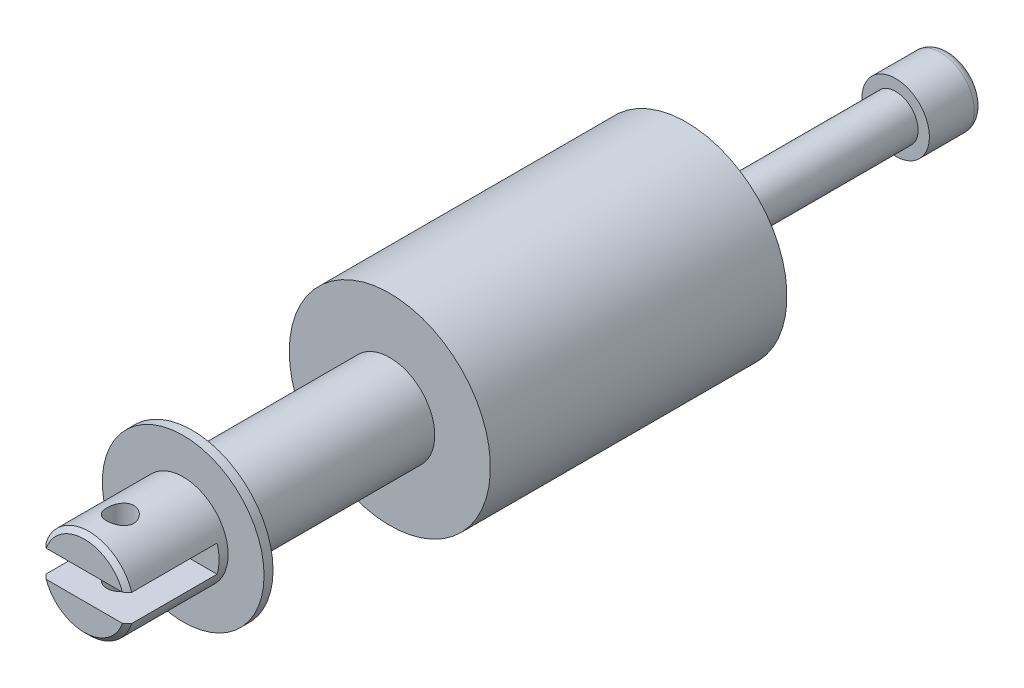
ISO-10303-21;
HEADER;
FILE_DESCRIPTION(('STEP AP214'),'2;1');
FILE_NAME('part.step','',(''),(''),'','','');
FILE_SCHEMA(('AUTOMOTIVE_DESIGN { 1 0 10303 214 1 1 1 1 }'));
ENDSEC;
DATA;
#1=APPLICATION_CONTEXT('core data for automotive mechanical design processes');
#2=APPLICATION_PROTOCOL_DEFINITION('international standard','automotive_design',2000,#1);
#3=PRODUCT_CONTEXT('',#1,'mechanical');
#4=PRODUCT('Part','Part','',(#3));
#5=PRODUCT_RELATED_PRODUCT_CATEGORY('part','',(#4));
#6=PRODUCT_DEFINITION_FORMATION('','',#4);
#7=PRODUCT_DEFINITION_CONTEXT('part definition',#1,'design');
#8=PRODUCT_DEFINITION('design','',#6,#7);
#9=PRODUCT_DEFINITION_SHAPE('','',#8);
#10=(LENGTH_UNIT() NAMED_UNIT(*) SI_UNIT(.MILLI.,.METRE.));
#11=(NAMED_UNIT(*) PLANE_ANGLE_UNIT() SI_UNIT($,.RADIAN.));
#12=(NAMED_UNIT(*) SI_UNIT($,.STERADIAN.) SOLID_ANGLE_UNIT());
#13=UNCERTAINTY_MEASURE_WITH_UNIT(LENGTH_MEASURE(1.E-05),#10,'distance_accuracy_value','');
#14=(GEOMETRIC_REPRESENTATION_CONTEXT(3) GLOBAL_UNCERTAINTY_ASSIGNED_CONTEXT((#13)) GLOBAL_UNIT_ASSIGNED_CONTEXT((#10,
#11,#12)) REPRESENTATION_CONTEXT('',''));
#15=CARTESIAN_POINT('',(0.,0.,0.));
#16=DIRECTION('',(0.,0.,1.));
#17=DIRECTION('',(1.,0.,0.));
#18=AXIS2_PLACEMENT_3D('',#15,#16,#17);
#19=CARTESIAN_POINT('',(0.,0.,-46.1131813977626));
#20=DIRECTION('',(0.,0.,-1.));
#21=DIRECTION('',(-1.,0.,0.));
#22=AXIS2_PLACEMENT_3D('',#19,#20,#21);
#23=CYLINDRICAL_SURFACE('',#22,5.00000000000001);
#24=CARTESIAN_POINT('',(0.,0.,41.3710992223477));
#25=DIRECTION('',(0.,0.,-1.));
#26=DIRECTION('',(-1.,0.,0.));
#27=AXIS2_PLACEMENT_3D('',#24,#25,#26);
#28=CIRCLE('',#27,5.00000000000001);
#29=CARTESIAN_POINT('',(-5.00000000000001,0.,41.3710992223477));
#30=VERTEX_POINT('',#29);
#31=EDGE_CURVE('E209',#30,#30,#28,.T.);
#32=ORIENTED_EDGE('',*,*,#31,.F.);
#33=EDGE_LOOP('',(#32));
#34=FACE_BOUND('',#33,.T.);
#35=CARTESIAN_POINT('',(0.,0.,63.3710992223477));
#36=DIRECTION('',(0.,0.,1.));
#37=DIRECTION('',(1.,0.,0.));
#38=AXIS2_PLACEMENT_3D('',#35,#36,#37);
#39=CIRCLE('',#38,5.00000000000001);
#40=CARTESIAN_POINT('',(5.00000000000001,0.,63.3710992223477));
#41=VERTEX_POINT('',#40);
#42=EDGE_CURVE('E11',#41,#41,#39,.T.);
#43=ORIENTED_EDGE('',*,*,#42,.F.);
#44=EDGE_LOOP('',(#43));
#45=FACE_BOUND('',#44,.T.);
#46=ADVANCED_FACE('F36',(#34,#45),#23,.T.);
#47=CARTESIAN_POINT('',(11.1954432282886,0.,41.3710992223477));
#48=DIRECTION('',(0.,0.,-1.));
#49=DIRECTION('',(-1.,0.,0.));
#50=AXIS2_PLACEMENT_3D('',#47,#48,#49);
#51=PLANE('',#50);
#52=CARTESIAN_POINT('',(0.,0.,41.3710992223477));
#53=DIRECTION('',(0.,0.,-1.));
#54=DIRECTION('',(-1.,0.,0.));
#55=AXIS2_PLACEMENT_3D('',#52,#53,#54);
#56=CIRCLE('',#55,11.1954432282886);
#57=CARTESIAN_POINT('',(-11.1954432282886,0.,41.3710992223477));
#58=VERTEX_POINT('',#57);
#59=EDGE_CURVE('E308',#58,#58,#56,.T.);
#60=ORIENTED_EDGE('',*,*,#59,.F.);
#61=EDGE_LOOP('',(#60));
#62=FACE_BOUND('',#61,.T.);
#63=ORIENTED_EDGE('',*,*,#31,.T.);
#64=EDGE_LOOP('',(#63));
#65=FACE_BOUND('',#64,.T.);
#66=ADVANCED_FACE('F160',(#62,#65),#51,.F.);
#67=CARTESIAN_POINT('',(0.,0.,-46.1131813977626));
#68=DIRECTION('',(0.,0.,-1.));
#69=DIRECTION('',(-1.,0.,0.));
#70=AXIS2_PLACEMENT_3D('',#67,#68,#69);
#71=CYLINDRICAL_SURFACE('',#70,11.1954432282886);
#72=CARTESIAN_POINT('',(0.,0.,8.37109922234772));
#73=DIRECTION('',(0.,0.,-1.));
#74=DIRECTION('',(-1.,0.,0.));
#75=AXIS2_PLACEMENT_3D('',#72,#73,#74);
#76=CIRCLE('',#75,11.1954432282886);
#77=CARTESIAN_POINT('',(-11.1954432282886,0.,8.37109922234772));
#78=VERTEX_POINT('',#77);
#79=EDGE_CURVE('E305',#78,#78,#76,.T.);
#80=ORIENTED_EDGE('',*,*,#79,.F.);
#81=EDGE_LOOP('',(#80));
#82=FACE_BOUND('',#81,.T.);
#83=ORIENTED_EDGE('',*,*,#59,.T.);
#84=EDGE_LOOP('',(#83));
#85=FACE_BOUND('',#84,.T.);
#86=ADVANCED_FACE('F156',(#82,#85),#71,.T.);
#87=CARTESIAN_POINT('',(2.49999999999999,0.,8.37109922234772));
#88=DIRECTION('',(0.,0.,1.));
#89=DIRECTION('',(1.,0.,0.));
#90=AXIS2_PLACEMENT_3D('',#87,#88,#89);
#91=PLANE('',#90);
#92=CARTESIAN_POINT('',(0.,0.,8.37109922234772));
#93=DIRECTION('',(0.,0.,-1.));
#94=DIRECTION('',(-1.,0.,0.));
#95=AXIS2_PLACEMENT_3D('',#92,#93,#94);
#96=CIRCLE('',#95,2.49999999999999);
#97=CARTESIAN_POINT('',(-2.49999999999999,0.,8.37109922234772));
#98=VERTEX_POINT('',#97);
#99=EDGE_CURVE('E302',#98,#98,#96,.T.);
#100=ORIENTED_EDGE('',*,*,#99,.F.);
#101=EDGE_LOOP('',(#100));
#102=FACE_BOUND('',#101,.T.);
#103=ORIENTED_EDGE('',*,*,#79,.T.);
#104=EDGE_LOOP('',(#103));
#105=FACE_BOUND('',#104,.T.);
#106=ADVANCED_FACE('F152',(#102,#105),#91,.F.);
#107=CARTESIAN_POINT('',(0.,0.,-46.1131813977626));
#108=DIRECTION('',(0.,0.,-1.));
#109=DIRECTION('',(-1.,0.,0.));
#110=AXIS2_PLACEMENT_3D('',#107,#108,#109);
#111=CYLINDRICAL_SURFACE('',#110,2.49999999999999);
#112=CARTESIAN_POINT('',(0.,0.,-14.9289007776523));
#113=DIRECTION('',(0.,0.,-1.));
#114=DIRECTION('',(-1.,0.,0.));
#115=AXIS2_PLACEMENT_3D('',#112,#113,#114);
#116=CIRCLE('',#115,2.49999999999999);
#117=CARTESIAN_POINT('',(-2.49999999999999,0.,-14.9289007776523));
#118=VERTEX_POINT('',#117);
#119=EDGE_CURVE('E299',#118,#118,#116,.T.);
#120=ORIENTED_EDGE('',*,*,#119,.F.);
#121=EDGE_LOOP('',(#120));
#122=FACE_BOUND('',#121,.T.);
#123=ORIENTED_EDGE('',*,*,#99,.T.);
#124=EDGE_LOOP('',(#123));
#125=FACE_BOUND('',#124,.T.);
#126=ADVANCED_FACE('F148',(#122,#125),#111,.T.);
#127=CARTESIAN_POINT('',(2.49999999999999,0.,-14.9289007776523));
#128=DIRECTION('',(0.,0.,-1.));
#129=DIRECTION('',(-1.,0.,0.));
#130=AXIS2_PLACEMENT_3D('',#127,#128,#129);
#131=PLANE('',#130);
#132=CARTESIAN_POINT('',(0.,0.,-14.9289007776523));
#133=DIRECTION('',(0.,0.,-1.));
#134=DIRECTION('',(-1.,0.,0.));
#135=AXIS2_PLACEMENT_3D('',#132,#133,#134);
#136=CIRCLE('',#135,3.75000000000001);
#137=CARTESIAN_POINT('',(-3.75000000000001,0.,-14.9289007776523));
#138=VERTEX_POINT('',#137);
#139=EDGE_CURVE('E291',#138,#138,#136,.T.);
#140=ORIENTED_EDGE('',*,*,#139,.F.);
#141=EDGE_LOOP('',(#140));
#142=FACE_BOUND('',#141,.T.);
#143=ORIENTED_EDGE('',*,*,#119,.T.);
#144=EDGE_LOOP('',(#143));
#145=FACE_BOUND('',#144,.T.);
#146=ADVANCED_FACE('F144',(#142,#145),#131,.F.);
#147=CARTESIAN_POINT('',(0.,0.,-46.1131813977626));
#148=DIRECTION('',(0.,0.,-1.));
#149=DIRECTION('',(-1.,0.,0.));
#150=AXIS2_PLACEMENT_3D('',#147,#148,#149);
#151=CYLINDRICAL_SURFACE('',#150,3.75000000000001);
#152=CARTESIAN_POINT('',(0.,0.,-19.9289007776523));
#153=DIRECTION('',(0.,0.,1.));
#154=DIRECTION('',(1.,0.,0.));
#155=AXIS2_PLACEMENT_3D('',#152,#153,#154);
#156=CIRCLE('',#155,3.75000000000001);
#157=CARTESIAN_POINT('',(3.75000000000001,0.,-19.9289007776523));
#158=VERTEX_POINT('',#157);
#159=EDGE_CURVE('E44',#158,#158,#156,.T.);
#160=ORIENTED_EDGE('',*,*,#159,.T.);
#161=EDGE_LOOP('',(#160));
#162=FACE_BOUND('',#161,.T.);
#163=ORIENTED_EDGE('',*,*,#139,.T.);
#164=EDGE_LOOP('',(#163));
#165=FACE_BOUND('',#164,.T.);
#166=ADVANCED_FACE('F140',(#162,#165),#151,.T.);
#167=CARTESIAN_POINT('',(2.49999999999999,0.,-20.9289007776523));
#168=DIRECTION('',(0.,0.,1.));
#169=DIRECTION('',(1.,0.,0.));
#170=AXIS2_PLACEMENT_3D('',#167,#168,#169);
#171=PLANE('',#170);
#172=CARTESIAN_POINT('',(0.,0.,-20.9289007776523));
#173=DIRECTION('',(0.,0.,1.));
#174=DIRECTION('',(1.,0.,0.));
#175=AXIS2_PLACEMENT_3D('',#172,#173,#174);
#176=CIRCLE('',#175,2.75000000000001);
#177=CARTESIAN_POINT('',(2.75000000000001,0.,-20.9289007776523));
#178=VERTEX_POINT('',#177);
#179=EDGE_CURVE('E238',#178,#178,#176,.F.);
#180=ORIENTED_EDGE('',*,*,#179,.T.);
#181=EDGE_LOOP('',(#180));
#182=FACE_BOUND('',#181,.T.);
#183=ADVANCED_FACE('F137',(#182),#171,.F.);
#184=CARTESIAN_POINT('',(0.,0.,-19.9289007776523));
#185=DIRECTION('',(0.,0.,1.));
#186=DIRECTION('',(1.,0.,0.));
#187=AXIS2_PLACEMENT_3D('',#184,#185,#186);
#188=TOROIDAL_SURFACE('',#187,2.75000000000001,1.);
#189=ORIENTED_EDGE('',*,*,#159,.F.);
#190=EDGE_LOOP('',(#189));
#191=FACE_BOUND('',#190,.T.);
#192=ORIENTED_EDGE('',*,*,#179,.F.);
#193=EDGE_LOOP('',(#192));
#194=FACE_BOUND('',#193,.T.);
#195=ADVANCED_FACE('F38',(#191,#194),#188,.T.);
#196=CARTESIAN_POINT('',(0.,0.,63.3710992223477));
#197=DIRECTION('',(0.,0.,1.));
#198=DIRECTION('',(1.,0.,0.));
#199=AXIS2_PLACEMENT_3D('',#196,#197,#198);
#200=CYLINDRICAL_SURFACE('',#199,9.);
#201=CARTESIAN_POINT('',(0.,0.,63.3710992223477));
#202=DIRECTION('',(0.,0.,1.));
#203=DIRECTION('',(1.,0.,0.));
#204=AXIS2_PLACEMENT_3D('',#201,#202,#203);
#205=CIRCLE('',#204,9.);
#206=CARTESIAN_POINT('',(9.,0.,63.3710992223477));
#207=VERTEX_POINT('',#206);
#208=EDGE_CURVE('E219',#207,#207,#205,.T.);
#209=ORIENTED_EDGE('',*,*,#208,.T.);
#210=EDGE_LOOP('',(#209));
#211=FACE_BOUND('',#210,.T.);
#212=CARTESIAN_POINT('',(0.,0.,64.3710992223477));
#213=DIRECTION('',(0.,0.,1.));
#214=DIRECTION('',(1.,0.,0.));
#215=AXIS2_PLACEMENT_3D('',#212,#213,#214);
#216=CIRCLE('',#215,9.);
#217=CARTESIAN_POINT('',(9.,0.,64.3710992223477));
#218=VERTEX_POINT('',#217);
#219=EDGE_CURVE('E222',#218,#218,#216,.T.);
#220=ORIENTED_EDGE('',*,*,#219,.F.);
#221=EDGE_LOOP('',(#220));
#222=FACE_BOUND('',#221,.T.);
#223=ADVANCED_FACE('F193',(#211,#222),#200,.T.);
#224=CARTESIAN_POINT('',(0.,0.,63.3710992223477));
#225=DIRECTION('',(0.,0.,1.));
#226=DIRECTION('',(1.,0.,0.));
#227=AXIS2_PLACEMENT_3D('',#224,#225,#226);
#228=PLANE('',#227);
#229=ORIENTED_EDGE('',*,*,#42,.T.);
#230=EDGE_LOOP('',(#229));
#231=FACE_BOUND('',#230,.T.);
#232=ORIENTED_EDGE('',*,*,#208,.F.);
#233=EDGE_LOOP('',(#232));
#234=FACE_BOUND('',#233,.T.);
#235=ADVANCED_FACE('F212',(#231,#234),#228,.F.);
#236=CARTESIAN_POINT('',(0.,0.,64.3710992223477));
#237=DIRECTION('',(0.,0.,1.));
#238=DIRECTION('',(1.,0.,0.));
#239=AXIS2_PLACEMENT_3D('',#236,#237,#238);
#240=PLANE('',#239);
#241=CARTESIAN_POINT('',(0.,0.,64.3710992223477));
#242=DIRECTION('',(0.,0.,1.));
#243=DIRECTION('',(1.,0.,0.));
#244=AXIS2_PLACEMENT_3D('',#241,#242,#243);
#245=CIRCLE('',#244,5.00000000000001);
#246=CARTESIAN_POINT('',(5.00000000000001,0.,64.3710992223477));
#247=VERTEX_POINT('',#246);
#248=EDGE_CURVE('E221',#247,#247,#245,.T.);
#249=ORIENTED_EDGE('',*,*,#248,.F.);
#250=EDGE_LOOP('',(#249));
#251=FACE_BOUND('',#250,.T.);
#252=ORIENTED_EDGE('',*,*,#219,.T.);
#253=EDGE_LOOP('',(#252));
#254=FACE_BOUND('',#253,.T.);
#255=ADVANCED_FACE('F215',(#251,#254),#240,.T.);
#256=CARTESIAN_POINT('',(0.,0.,75.3710992223477));
#257=DIRECTION('',(0.,0.,-1.));
#258=DIRECTION('',(-1.,0.,0.));
#259=AXIS2_PLACEMENT_3D('',#256,#257,#258);
#260=PLANE('',#259);
#261=CARTESIAN_POINT('',(0.,0.,75.3710992223477));
#262=DIRECTION('',(0.,0.,-1.));
#263=DIRECTION('',(-1.,0.,0.));
#264=AXIS2_PLACEMENT_3D('',#261,#262,#263);
#265=CIRCLE('',#264,4.49999999999999);
#266=CARTESIAN_POINT('',(4.24264068711927,1.5,75.3710992223477));
#267=VERTEX_POINT('',#266);
#268=CARTESIAN_POINT('',(-4.24264068711927,1.5,75.3710992223477));
#269=VERTEX_POINT('',#268);
#270=EDGE_CURVE('E103',#267,#269,#265,.F.);
#271=ORIENTED_EDGE('',*,*,#270,.T.);
#272=DIRECTION('',(-1.,0.,0.));
#273=VECTOR('',#272,1.);
#274=CARTESIAN_POINT('',(-8.,1.5,75.3710992223477));
#275=LINE('',#274,#273);
#276=EDGE_CURVE('E51',#267,#269,#275,.T.);
#277=ORIENTED_EDGE('',*,*,#276,.F.);
#278=EDGE_LOOP('',(#271,#277));
#279=FACE_BOUND('',#278,.T.);
#280=ADVANCED_FACE('F102',(#279),#260,.F.);
#281=CARTESIAN_POINT('',(-4.24264068711927,-1.5,75.3710992223477));
#282=VERTEX_POINT('',#281);
#283=CARTESIAN_POINT('',(4.24264068711927,-1.5,75.3710992223477));
#284=VERTEX_POINT('',#283);
#285=EDGE_CURVE('E108',#282,#284,#265,.F.);
#286=ORIENTED_EDGE('',*,*,#285,.T.);
#287=DIRECTION('',(1.,0.,0.));
#288=VECTOR('',#287,1.);
#289=CARTESIAN_POINT('',(-8.,-1.5,75.3710992223477));
#290=LINE('',#289,#288);
#291=EDGE_CURVE('E104',#282,#284,#290,.T.);
#292=ORIENTED_EDGE('',*,*,#291,.F.);
#293=EDGE_LOOP('',(#286,#292));
#294=FACE_BOUND('',#293,.T.);
#295=ADVANCED_FACE('F191',(#294),#260,.F.);
#296=CARTESIAN_POINT('',(0.,11.,71.3710992223477));
#297=DIRECTION('',(0.,-1.,0.));
#298=DIRECTION('',(0.,0.,-1.));
#299=AXIS2_PLACEMENT_3D('',#296,#297,#298);
#300=CYLINDRICAL_SURFACE('',#299,1.5);
#301=CARTESIAN_POINT('',(0.,1.5,71.3710992223477));
#302=DIRECTION('',(0.,1.,0.));
#303=DIRECTION('',(0.,0.,1.));
#304=AXIS2_PLACEMENT_3D('',#301,#302,#303);
#305=CIRCLE('',#304,1.5);
#306=CARTESIAN_POINT('',(0.,1.5,72.8710992223477));
#307=VERTEX_POINT('',#306);
#308=EDGE_CURVE('E225',#307,#307,#305,.F.);
#309=ORIENTED_EDGE('',*,*,#308,.T.);
#310=EDGE_LOOP('',(#309));
#311=FACE_BOUND('',#310,.T.);
#312=CARTESIAN_POINT('',(0.,5.00000000000001,69.8710992223477));
#313=CARTESIAN_POINT('',(-0.0822886127533002,4.99999929250551,69.8711002198326));
#314=CARTESIAN_POINT('',(-0.16458731835153,4.99794915693955,69.8778930859717));
#315=CARTESIAN_POINT('',(-0.326788125304881,4.98997105593692,69.9048205765698));
#316=CARTESIAN_POINT('',(-0.40668950441142,4.98404193389693,69.9249591803711));
#317=CARTESIAN_POINT('',(-0.561732707754528,4.96895552501838,69.977845239258));
#318=CARTESIAN_POINT('',(-0.636881364395376,4.95980300250427,70.0105740919666));
#319=CARTESIAN_POINT('',(-0.780624181053136,4.93922109237647,70.0876353154035));
#320=CARTESIAN_POINT('',(-0.849217467469672,4.92779140192068,70.1319692297431));
#321=CARTESIAN_POINT('',(-0.97987179718375,4.90350737192775,70.2323232298204));
#322=CARTESIAN_POINT('',(-1.04171807124435,4.89062383657038,70.2886158482336));
#323=CARTESIAN_POINT('',(-1.15524920923324,4.86505834210443,70.4107084522579));
#324=CARTESIAN_POINT('',(-1.20693236327441,4.85237641724503,70.4765100344727));
#325=CARTESIAN_POINT('',(-1.29980037723708,4.82834113993773,70.6175699753853));
#326=CARTESIAN_POINT('',(-1.34072309022214,4.81702406663876,70.6930076833385));
#327=CARTESIAN_POINT('',(-1.40921394774761,4.79743620394032,70.850088476578));
#328=CARTESIAN_POINT('',(-1.43678529919973,4.78916468313312,70.9317300662757));
#329=CARTESIAN_POINT('',(-1.47701633682652,4.77690870838436,71.0964894884782));
#330=CARTESIAN_POINT('',(-1.49007196234678,4.77281069324535,71.1795019662117));
#331=CARTESIAN_POINT('',(-1.50213730614672,4.76902789749769,71.3466323785645));
#332=CARTESIAN_POINT('',(-1.50115042761078,4.76934204760573,71.4307500404068));
#333=CARTESIAN_POINT('',(-1.48546977199812,4.77424744067779,71.5944831309562));
#334=CARTESIAN_POINT('',(-1.47127205262685,4.77868388599142,71.67415147271));
#335=CARTESIAN_POINT('',(-1.43037420427056,4.79108356228626,71.8299190086212));
#336=CARTESIAN_POINT('',(-1.40367284141641,4.79904714132352,71.906017849722));
#337=CARTESIAN_POINT('',(-1.33816026653682,4.81772733074974,72.0536995720085));
#338=CARTESIAN_POINT('',(-1.29918816934643,4.82848016115954,72.125206306303));
#339=CARTESIAN_POINT('',(-1.21035222588683,4.85150987000066,72.2608312443579));
#340=CARTESIAN_POINT('',(-1.16048574002588,4.86378711746993,72.3249476517615));
#341=CARTESIAN_POINT('',(-1.04881290765545,4.88911011297939,72.4467854131097));
#342=CARTESIAN_POINT('',(-0.986594907466965,4.90216654310499,72.5041278863774));
#343=CARTESIAN_POINT('',(-0.853263259313962,4.9271224406326,72.607653206412));
#344=CARTESIAN_POINT('',(-0.782149051860884,4.93902183518411,72.6538353507621));
#345=CARTESIAN_POINT('',(-0.632355038342799,4.96043160069472,72.7339591448125));
#346=CARTESIAN_POINT('',(-0.553627749747946,4.96992543668315,72.7678167385976));
#347=CARTESIAN_POINT('',(-0.391245415603516,4.98533521832223,72.8216988124474));
#348=CARTESIAN_POINT('',(-0.307591751589579,4.99125216187001,72.8417271508802));
#349=CARTESIAN_POINT('',(-0.14095224266833,4.9986836464354,72.8667514002471));
#350=CARTESIAN_POINT('',(-0.0580500976011853,5.00034850417791,72.8722608081493));
#351=CARTESIAN_POINT('',(0.107499605823384,4.99952923241761,72.8695300666356));
#352=CARTESIAN_POINT('',(0.190147196690782,4.99704565677758,72.8612917526963));
#353=CARTESIAN_POINT('',(0.350903605309698,4.98830696987164,72.8317146112362));
#354=CARTESIAN_POINT('',(0.429072772614171,4.98213829799418,72.8106758347669));
#355=CARTESIAN_POINT('',(0.580754638954524,4.96674347841534,72.7564559895695));
#356=CARTESIAN_POINT('',(0.654266777025585,4.95751696321086,72.7232734613099));
#357=CARTESIAN_POINT('',(0.796437189461051,4.93669654351326,72.6448460568666));
#358=CARTESIAN_POINT('',(0.864943826199666,4.92505280829676,72.5993398813997));
#359=CARTESIAN_POINT('',(0.993523307980143,4.90073468764319,72.4978744682949));
#360=CARTESIAN_POINT('',(1.05359403235593,4.88806004431081,72.4419126104601));
#361=CARTESIAN_POINT('',(1.16585744551027,4.86253171869139,72.3187119139784));
#362=CARTESIAN_POINT('',(1.21768481231503,4.84968825033269,72.251137346576));
#363=CARTESIAN_POINT('',(1.30928995072154,4.82576515238465,72.1079712833342));
#364=CARTESIAN_POINT('',(1.34906803829472,4.81468547654653,72.0323799977895));
#365=CARTESIAN_POINT('',(1.41517347127169,4.79567189615056,71.875566731093));
#366=CARTESIAN_POINT('',(1.4415634693705,4.78772337843828,71.7943730358111));
#367=CARTESIAN_POINT('',(1.48021730815114,4.77591594362796,71.6284112534162));
#368=CARTESIAN_POINT('',(1.49248598978779,4.77205562508302,71.54364440156));
#369=CARTESIAN_POINT('',(1.50221984485059,4.76899972496088,71.3767377039715));
#370=CARTESIAN_POINT('',(1.5002805530849,4.76961647442756,71.2946355713301));
#371=CARTESIAN_POINT('',(1.48307505444813,4.77499401288296,71.1319851189749));
#372=CARTESIAN_POINT('',(1.46780938124716,4.77975463592553,71.0514367371714));
#373=CARTESIAN_POINT('',(1.42476888804136,4.79275763670387,70.8951538232049));
#374=CARTESIAN_POINT('',(1.39715175507069,4.80095604545966,70.819371934986));
#375=CARTESIAN_POINT('',(1.3303150712113,4.81990278909138,70.67345678353));
#376=CARTESIAN_POINT('',(1.29109329962877,4.83065161194313,70.603324604707));
#377=CARTESIAN_POINT('',(1.20048763805073,4.85397676425834,70.4679361058206));
#378=CARTESIAN_POINT('',(1.14871276092994,4.86660540163799,70.4029504610873));
#379=CARTESIAN_POINT('',(1.03517434629782,4.89201320450027,70.2823967240399));
#380=CARTESIAN_POINT('',(0.973408217134498,4.90479240823907,70.22683108288));
#381=CARTESIAN_POINT('',(0.839465762183242,4.9295093657065,70.1250758100527));
#382=CARTESIAN_POINT('',(0.767037885790598,4.94141159765676,70.0792077754922));
#383=CARTESIAN_POINT('',(0.61514137398352,4.96260680455815,70.0003640524437));
#384=CARTESIAN_POINT('',(0.535676052998948,4.97190099931068,69.9673823340732));
#385=CARTESIAN_POINT('',(0.380757712655277,4.98602174969302,69.918203946695));
#386=CARTESIAN_POINT('',(0.30578696195423,4.99122027381069,69.9005875494645));
#387=CARTESIAN_POINT('',(0.153880195230777,4.99820944494494,69.8770356971061));
#388=CARTESIAN_POINT('',(0.0769445098581385,5.00000066154741,69.8710982896429));
#389=CARTESIAN_POINT('',(0.,5.00000000000001,69.8710992223477));
#390=B_SPLINE_CURVE_WITH_KNOTS('',3,(#312,#313,#314,#315,#316,#317,#318,#319,#320,#321,#322,
#323,#324,#325,#326,#327,#328,#329,#330,#331,#332,#333,#334,#335,#336,#337,#338,#339,#340,#341,
#342,#343,#344,#345,#346,#347,#348,#349,#350,#351,#352,#353,#354,#355,#356,#357,#358,#359,#360,
#361,#362,#363,#364,#365,#366,#367,#368,#369,#370,#371,#372,#373,#374,#375,#376,#377,#378,#379,
#380,#381,#382,#383,#384,#385,#386,#387,#388,#389),.UNSPECIFIED.,.T.,.F.,(4,2,2,2,2,2,2,2,2,2,2,
2,2,2,2,2,2,2,2,2,2,2,2,2,2,2,2,2,2,2,2,2,2,2,2,2,2,2,4),(0.,0.246583203612611,
0.493239964846002,0.739533676300876,0.985860164412703,1.23855602948192,1.49129437288633,
1.74971481004109,2.00807314543223,2.25919689356601,2.5102597831909,2.75226016697675,
2.99428443658001,3.23962426447121,3.48502360158557,3.74067104048168,3.99633456531072,
4.2537104688169,4.51101453528808,4.75908809438545,5.00712853550327,5.24956746682327,
5.49203554593729,5.74011305702908,5.98825282000191,6.2454040032282,6.50254844252682,
6.75847814951253,7.01432009460284,7.25950155466943,7.504673196616,7.74680040402721,
7.98897397553107,8.23996925679931,8.49102974897504,8.74942996156673,9.00770911595237,
9.23831691930461,9.46888616948875),.UNSPECIFIED.);
#391=CARTESIAN_POINT('',(0.,5.00000000000001,69.8710992223477));
#392=VERTEX_POINT('',#391);
#393=EDGE_CURVE('E105',#392,#392,#390,.T.);
#394=ORIENTED_EDGE('',*,*,#393,.T.);
#395=EDGE_LOOP('',(#394));
#396=FACE_BOUND('',#395,.T.);
#397=ADVANCED_FACE('F186',(#311,#396),#300,.F.);
#398=CARTESIAN_POINT('',(0.,-1.5,71.3710992223477));
#399=DIRECTION('',(0.,-1.,0.));
#400=DIRECTION('',(0.,0.,-1.));
#401=AXIS2_PLACEMENT_3D('',#398,#399,#400);
#402=CIRCLE('',#401,1.5);
#403=CARTESIAN_POINT('',(0.,-1.5,69.8710992223477));
#404=VERTEX_POINT('',#403);
#405=EDGE_CURVE('E228',#404,#404,#402,.F.);
#406=ORIENTED_EDGE('',*,*,#405,.T.);
#407=EDGE_LOOP('',(#406));
#408=FACE_BOUND('',#407,.T.);
#409=CARTESIAN_POINT('',(0.,-5.00000000000001,69.8710992223477));
#410=CARTESIAN_POINT('',(0.0822886127533002,-4.99999929250551,69.8711002198326));
#411=CARTESIAN_POINT('',(0.16458731835153,-4.99794915693955,69.8778930859717));
#412=CARTESIAN_POINT('',(0.326788125304881,-4.98997105593692,69.9048205765698));
#413=CARTESIAN_POINT('',(0.40668950441142,-4.98404193389693,69.9249591803711));
#414=CARTESIAN_POINT('',(0.561732707754528,-4.96895552501838,69.977845239258));
#415=CARTESIAN_POINT('',(0.636881364395376,-4.95980300250427,70.0105740919666));
#416=CARTESIAN_POINT('',(0.780624181053136,-4.93922109237647,70.0876353154035));
#417=CARTESIAN_POINT('',(0.849217467469672,-4.92779140192068,70.1319692297431));
#418=CARTESIAN_POINT('',(0.97987179718375,-4.90350737192775,70.2323232298204));
#419=CARTESIAN_POINT('',(1.04171807124435,-4.89062383657038,70.2886158482336));
#420=CARTESIAN_POINT('',(1.15524920923324,-4.86505834210443,70.4107084522579));
#421=CARTESIAN_POINT('',(1.20693236327441,-4.85237641724503,70.4765100344727));
#422=CARTESIAN_POINT('',(1.29980037723708,-4.82834113993773,70.6175699753853));
#423=CARTESIAN_POINT('',(1.34072309022214,-4.81702406663876,70.6930076833385));
#424=CARTESIAN_POINT('',(1.40921394774761,-4.79743620394032,70.850088476578));
#425=CARTESIAN_POINT('',(1.43678529919973,-4.78916468313312,70.9317300662757));
#426=CARTESIAN_POINT('',(1.47701633682652,-4.77690870838436,71.0964894884782));
#427=CARTESIAN_POINT('',(1.49007196234678,-4.77281069324535,71.1795019662117));
#428=CARTESIAN_POINT('',(1.50213730614672,-4.76902789749769,71.3466323785645));
#429=CARTESIAN_POINT('',(1.50115042761078,-4.76934204760573,71.4307500404068));
#430=CARTESIAN_POINT('',(1.48546977199812,-4.77424744067779,71.5944831309562));
#431=CARTESIAN_POINT('',(1.47127205262685,-4.77868388599142,71.67415147271));
#432=CARTESIAN_POINT('',(1.43037420427056,-4.79108356228626,71.8299190086212));
#433=CARTESIAN_POINT('',(1.40367284141641,-4.79904714132352,71.906017849722));
#434=CARTESIAN_POINT('',(1.33816026653682,-4.81772733074974,72.0536995720085));
#435=CARTESIAN_POINT('',(1.29918816934643,-4.82848016115954,72.125206306303));
#436=CARTESIAN_POINT('',(1.21035222588683,-4.85150987000066,72.2608312443579));
#437=CARTESIAN_POINT('',(1.16048574002588,-4.86378711746993,72.3249476517615));
#438=CARTESIAN_POINT('',(1.04881290765545,-4.88911011297939,72.4467854131097));
#439=CARTESIAN_POINT('',(0.986594907466965,-4.90216654310499,72.5041278863774));
#440=CARTESIAN_POINT('',(0.853263259313962,-4.9271224406326,72.607653206412));
#441=CARTESIAN_POINT('',(0.782149051860884,-4.93902183518411,72.6538353507621));
#442=CARTESIAN_POINT('',(0.632355038342799,-4.96043160069472,72.7339591448125));
#443=CARTESIAN_POINT('',(0.553627749747946,-4.96992543668315,72.7678167385976));
#444=CARTESIAN_POINT('',(0.391245415603516,-4.98533521832223,72.8216988124474));
#445=CARTESIAN_POINT('',(0.307591751589579,-4.99125216187001,72.8417271508802));
#446=CARTESIAN_POINT('',(0.14095224266833,-4.9986836464354,72.8667514002471));
#447=CARTESIAN_POINT('',(0.0580500976011853,-5.00034850417791,72.8722608081493));
#448=CARTESIAN_POINT('',(-0.107499605823384,-4.99952923241761,72.8695300666356));
#449=CARTESIAN_POINT('',(-0.190147196690782,-4.99704565677758,72.8612917526963));
#450=CARTESIAN_POINT('',(-0.350903605309698,-4.98830696987164,72.8317146112362));
#451=CARTESIAN_POINT('',(-0.429072772614171,-4.98213829799418,72.8106758347669));
#452=CARTESIAN_POINT('',(-0.580754638954524,-4.96674347841534,72.7564559895695));
#453=CARTESIAN_POINT('',(-0.654266777025585,-4.95751696321086,72.7232734613099));
#454=CARTESIAN_POINT('',(-0.796437189461051,-4.93669654351326,72.6448460568666));
#455=CARTESIAN_POINT('',(-0.864943826199666,-4.92505280829676,72.5993398813997));
#456=CARTESIAN_POINT('',(-0.993523307980143,-4.90073468764319,72.4978744682949));
#457=CARTESIAN_POINT('',(-1.05359403235593,-4.88806004431081,72.4419126104601));
#458=CARTESIAN_POINT('',(-1.16585744551027,-4.86253171869139,72.3187119139784));
#459=CARTESIAN_POINT('',(-1.21768481231503,-4.84968825033269,72.251137346576));
#460=CARTESIAN_POINT('',(-1.30928995072154,-4.82576515238465,72.1079712833342));
#461=CARTESIAN_POINT('',(-1.34906803829472,-4.81468547654653,72.0323799977895));
#462=CARTESIAN_POINT('',(-1.41517347127169,-4.79567189615056,71.875566731093));
#463=CARTESIAN_POINT('',(-1.4415634693705,-4.78772337843828,71.7943730358111));
#464=CARTESIAN_POINT('',(-1.48021730815114,-4.77591594362796,71.6284112534162));
#465=CARTESIAN_POINT('',(-1.49248598978779,-4.77205562508302,71.54364440156));
#466=CARTESIAN_POINT('',(-1.50221984485059,-4.76899972496088,71.3767377039715));
#467=CARTESIAN_POINT('',(-1.5002805530849,-4.76961647442756,71.2946355713301));
#468=CARTESIAN_POINT('',(-1.48307505444813,-4.77499401288296,71.1319851189749));
#469=CARTESIAN_POINT('',(-1.46780938124716,-4.77975463592553,71.0514367371714));
#470=CARTESIAN_POINT('',(-1.42476888804136,-4.79275763670387,70.8951538232049));
#471=CARTESIAN_POINT('',(-1.39715175507069,-4.80095604545966,70.819371934986));
#472=CARTESIAN_POINT('',(-1.3303150712113,-4.81990278909138,70.67345678353));
#473=CARTESIAN_POINT('',(-1.29109329962877,-4.83065161194313,70.603324604707));
#474=CARTESIAN_POINT('',(-1.20048763805073,-4.85397676425834,70.4679361058206));
#475=CARTESIAN_POINT('',(-1.14871276092994,-4.86660540163799,70.4029504610873));
#476=CARTESIAN_POINT('',(-1.03517434629782,-4.89201320450027,70.2823967240399));
#477=CARTESIAN_POINT('',(-0.973408217134498,-4.90479240823907,70.22683108288));
#478=CARTESIAN_POINT('',(-0.839465762183242,-4.9295093657065,70.1250758100527));
#479=CARTESIAN_POINT('',(-0.767037885790598,-4.94141159765676,70.0792077754922));
#480=CARTESIAN_POINT('',(-0.61514137398352,-4.96260680455815,70.0003640524437));
#481=CARTESIAN_POINT('',(-0.535676052998948,-4.97190099931068,69.9673823340732));
#482=CARTESIAN_POINT('',(-0.380757712655277,-4.98602174969302,69.918203946695));
#483=CARTESIAN_POINT('',(-0.30578696195423,-4.99122027381069,69.9005875494645));
#484=CARTESIAN_POINT('',(-0.153880195230777,-4.99820944494494,69.8770356971061));
#485=CARTESIAN_POINT('',(-0.0769445098581385,-5.00000066154741,69.8710982896429));
#486=CARTESIAN_POINT('',(0.,-5.00000000000001,69.8710992223477));
#487=B_SPLINE_CURVE_WITH_KNOTS('',3,(#409,#410,#411,#412,#413,#414,#415,#416,#417,#418,#419,
#420,#421,#422,#423,#424,#425,#426,#427,#428,#429,#430,#431,#432,#433,#434,#435,#436,#437,#438,
#439,#440,#441,#442,#443,#444,#445,#446,#447,#448,#449,#450,#451,#452,#453,#454,#455,#456,#457,
#458,#459,#460,#461,#462,#463,#464,#465,#466,#467,#468,#469,#470,#471,#472,#473,#474,#475,#476,
#477,#478,#479,#480,#481,#482,#483,#484,#485,#486),.UNSPECIFIED.,.T.,.F.,(4,2,2,2,2,2,2,2,2,2,2,
2,2,2,2,2,2,2,2,2,2,2,2,2,2,2,2,2,2,2,2,2,2,2,2,2,2,2,4),(0.,0.246583203612611,
0.493239964846002,0.739533676300876,0.985860164412703,1.23855602948192,1.49129437288633,
1.74971481004109,2.00807314543223,2.25919689356601,2.5102597831909,2.75226016697675,
2.99428443658001,3.23962426447121,3.48502360158557,3.74067104048168,3.99633456531072,
4.2537104688169,4.51101453528808,4.75908809438545,5.00712853550327,5.24956746682327,
5.49203554593729,5.74011305702908,5.98825282000191,6.2454040032282,6.50254844252682,
6.75847814951253,7.01432009460284,7.25950155466943,7.504673196616,7.74680040402721,
7.98897397553107,8.23996925679931,8.49102974897504,8.74942996156673,9.00770911595237,
9.23831691930461,9.46888616948875),.UNSPECIFIED.);
#488=CARTESIAN_POINT('',(0.,-5.00000000000001,69.8710992223477));
#489=VERTEX_POINT('',#488);
#490=EDGE_CURVE('E172',#489,#489,#487,.T.);
#491=ORIENTED_EDGE('',*,*,#490,.T.);
#492=EDGE_LOOP('',(#491));
#493=FACE_BOUND('',#492,.T.);
#494=ADVANCED_FACE('F190',(#408,#493),#300,.F.);
#495=CARTESIAN_POINT('',(0.,0.,74.8710992223477));
#496=DIRECTION('',(0.,0.,-1.));
#497=DIRECTION('',(-1.,0.,0.));
#498=AXIS2_PLACEMENT_3D('',#495,#496,#497);
#499=CONICAL_SURFACE('',#498,5.00000000000001,0.785398163397458);
#500=CARTESIAN_POINT('',(10.9050151866759,1.5,68.8634039039975));
#501=CARTESIAN_POINT('',(10.5781062873374,1.5,69.1872485400958));
#502=CARTESIAN_POINT('',(10.2510760520653,1.5,69.5109709764377));
#503=CARTESIAN_POINT('',(9.59652692086829,1.5,70.1581772852018));
#504=CARTESIAN_POINT('',(9.26900788394834,1.5,70.4816610150119));
#505=CARTESIAN_POINT('',(8.61102137982263,1.5,71.1305775138725));
#506=CARTESIAN_POINT('',(8.28055028765446,1.5,71.4560066083952));
#507=CARTESIAN_POINT('',(7.61904943690606,1.5,72.1060413007084));
#508=CARTESIAN_POINT('',(7.28801994326666,1.5,72.430647167921));
#509=CARTESIAN_POINT('',(6.73655422800752,1.5,72.9697204519891));
#510=CARTESIAN_POINT('',(6.51640221254661,1.5,73.1844785156176));
#511=CARTESIAN_POINT('',(6.07549009935841,1.5,73.6133871153001));
#512=CARTESIAN_POINT('',(5.85472997815638,1.5,73.8275376272341));
#513=CARTESIAN_POINT('',(5.41209608644752,1.5,74.2552710592518));
#514=CARTESIAN_POINT('',(5.1902212309614,1.5,74.4688528578004));
#515=CARTESIAN_POINT('',(4.74532648646873,1.5,74.8947566441877));
#516=CARTESIAN_POINT('',(4.52230676829168,1.5,75.1070788103418));
#517=CARTESIAN_POINT('',(4.0758107466368,1.5,75.5286589918726));
#518=CARTESIAN_POINT('',(3.85234450106694,1.5,75.7379276182619));
#519=CARTESIAN_POINT('',(3.51500831417219,1.5,76.0496508902044));
#520=CARTESIAN_POINT('',(3.40217379010869,1.5,76.1532250534966));
#521=CARTESIAN_POINT('',(3.17560071482273,1.5,76.3593733027883));
#522=CARTESIAN_POINT('',(3.06186219553952,1.5,76.4619474238379));
#523=CARTESIAN_POINT('',(2.83346107020207,1.5,76.6655071546117));
#524=CARTESIAN_POINT('',(2.71880135689671,1.5,76.7664960006716));
#525=CARTESIAN_POINT('',(2.48786201898302,1.5,76.9665973935872));
#526=CARTESIAN_POINT('',(2.37158246975478,1.5,77.0657100272507));
#527=CARTESIAN_POINT('',(2.13685252993997,1.5,77.2611411334987));
#528=CARTESIAN_POINT('',(2.0184041685253,1.5,77.3574620199028));
#529=CARTESIAN_POINT('',(1.83827480930449,1.5,77.4987822995306));
#530=CARTESIAN_POINT('',(1.77783031004421,1.5,77.5453563155134));
#531=CARTESIAN_POINT('',(1.65593010921448,1.5,77.6371589584231));
#532=CARTESIAN_POINT('',(1.59447448875927,1.5,77.6823876924617));
#533=CARTESIAN_POINT('',(1.49742817847219,1.5,77.7517371529563));
#534=CARTESIAN_POINT('',(1.46226119028417,1.5,77.776451038324));
#535=CARTESIAN_POINT('',(1.39147894553293,1.5,77.8252362359233));
#536=CARTESIAN_POINT('',(1.35586365055371,1.5,77.8493074925278));
#537=CARTESIAN_POINT('',(1.28412047178351,1.5,77.8967032481462));
#538=CARTESIAN_POINT('',(1.24799241728191,1.5,77.920027489624));
#539=CARTESIAN_POINT('',(1.17517525486087,1.5,77.9657812488371));
#540=CARTESIAN_POINT('',(1.13848615237183,1.5,77.9882107752249));
#541=CARTESIAN_POINT('',(1.02809483091525,1.5,78.0535555177263));
#542=CARTESIAN_POINT('',(0.95346646322013,1.5,78.0949310855402));
#543=CARTESIAN_POINT('',(0.801222200499882,1.5,78.1717915214986));
#544=CARTESIAN_POINT('',(0.72360853573602,1.5,78.2072806858727));
#545=CARTESIAN_POINT('',(0.599814531205661,1.5,78.2561346379449));
#546=CARTESIAN_POINT('',(0.554772881498453,1.5,78.2723774035446));
#547=CARTESIAN_POINT('',(0.463655688538628,1.5,78.3016675171224));
#548=CARTESIAN_POINT('',(0.417580310661032,1.5,78.3147153722964));
#549=CARTESIAN_POINT('',(0.324690736010004,1.5,78.337019310869));
#550=CARTESIAN_POINT('',(0.27787995066661,1.5,78.3462894058154));
#551=CARTESIAN_POINT('',(0.183620853428568,1.5,78.3606194331282));
#552=CARTESIAN_POINT('',(0.136172722749851,1.5,78.3656805375215));
#553=CARTESIAN_POINT('',(0.0406022216238933,1.5,78.3713142135373));
#554=CARTESIAN_POINT('',(-0.00752245631282756,1.5,78.3718484272038));
#555=CARTESIAN_POINT('',(-0.103597243054649,1.5,78.3682927915931));
#556=CARTESIAN_POINT('',(-0.151547351398468,1.5,78.3642029301061));
#557=CARTESIAN_POINT('',(-0.246991663542384,1.5,78.3516390714794));
#558=CARTESIAN_POINT('',(-0.294484292428579,1.5,78.3431533010852));
#559=CARTESIAN_POINT('',(-0.388593366349276,1.5,78.3222619067348));
#560=CARTESIAN_POINT('',(-0.435209626008702,1.5,78.3098554631214));
#561=CARTESIAN_POINT('',(-0.552522774702922,1.5,78.2740140145003));
#562=CARTESIAN_POINT('',(-0.622506929579488,1.5,78.2482525803395));
#563=CARTESIAN_POINT('',(-0.759956246794925,1.5,78.1907346373004));
#564=CARTESIAN_POINT('',(-0.827419336847824,1.5,78.1589733210141));
#565=CARTESIAN_POINT('',(-0.960406303201185,1.5,78.0909020504987));
#566=CARTESIAN_POINT('',(-1.02591892519871,1.5,78.0545703552023));
#567=CARTESIAN_POINT('',(-1.12272069235878,1.5,77.9976466380768));
#568=CARTESIAN_POINT('',(-1.15473805667495,1.5,77.9782712331413));
#569=CARTESIAN_POINT('',(-1.218334703658,1.5,77.9388161902483));
#570=CARTESIAN_POINT('',(-1.2499140043228,1.5,77.9187365813435));
#571=CARTESIAN_POINT('',(-1.35566438222355,1.5,77.8500554437455));
#572=CARTESIAN_POINT('',(-1.42892928018802,1.5,77.8000576934235));
#573=CARTESIAN_POINT('',(-1.57373487008095,1.5,77.6976158072318));
#574=CARTESIAN_POINT('',(-1.64527516070031,1.5,77.6451711101444));
#575=CARTESIAN_POINT('',(-1.78703863770426,1.5,77.5384334713571));
#576=CARTESIAN_POINT('',(-1.85726085128295,1.5,77.4841392418425));
#577=CARTESIAN_POINT('',(-1.996617536654,1.5,77.3741695000117));
#578=CARTESIAN_POINT('',(-2.06575194365714,1.5,77.3184939059273));
#579=CARTESIAN_POINT('',(-2.27218871840618,1.5,77.1496069346303));
#580=CARTESIAN_POINT('',(-2.40818245569134,1.5,77.0347981196172));
#581=CARTESIAN_POINT('',(-2.67779340608246,1.5,76.8025590551185));
#582=CARTESIAN_POINT('',(-2.81141158938303,1.5,76.6851299221355));
#583=CARTESIAN_POINT('',(-3.07748731555702,1.5,76.4480496643054));
#584=CARTESIAN_POINT('',(-3.20993926251213,1.5,76.328392270393));
#585=CARTESIAN_POINT('',(-3.47367698557359,1.5,76.0877754512445));
#586=CARTESIAN_POINT('',(-3.60496264027296,1.5,75.9668158932905));
#587=CARTESIAN_POINT('',(-3.9971179483785,1.5,75.6029188685041));
#588=CARTESIAN_POINT('',(-4.25669714718982,1.5,75.3585922129158));
#589=CARTESIAN_POINT('',(-4.78762231803646,1.5,74.854718173215));
#590=CARTESIAN_POINT('',(-5.05885716024406,1.5,74.5950542169056));
#591=CARTESIAN_POINT('',(-5.59990458188001,1.5,74.0742402783422));
#592=CARTESIAN_POINT('',(-5.86971713571291,1.5,73.8130902695198));
#593=CARTESIAN_POINT('',(-6.40855971717467,1.5,73.2896428976798));
#594=CARTESIAN_POINT('',(-6.67758913744264,1.5,73.0273449101909));
#595=CARTESIAN_POINT('',(-7.21497768276917,1.5,72.5020630676759));
#596=CARTESIAN_POINT('',(-7.48333680729055,1.5,72.2390792121004));
#597=CARTESIAN_POINT('',(-8.01502090426631,1.5,71.7170782212297));
#598=CARTESIAN_POINT('',(-8.27835407952547,1.5,71.4580694373941));
#599=CARTESIAN_POINT('',(-8.80466536119398,1.5,70.9396903247732));
#600=CARTESIAN_POINT('',(-9.06764346684569,1.5,70.680319995219));
#601=CARTESIAN_POINT('',(-9.59314357974434,1.5,70.1614823370963));
#602=CARTESIAN_POINT('',(-9.85566577687113,1.5,69.9020152008038));
#603=CARTESIAN_POINT('',(-10.3804909763969,1.5,69.3828608349707));
#604=CARTESIAN_POINT('',(-10.6427939794249,1.5,69.123173606066));
#605=CARTESIAN_POINT('',(-10.9050151866759,1.5,68.8634039039975));
#606=B_SPLINE_CURVE_WITH_KNOTS('',3,(#500,#501,#502,#503,#504,#505,#506,#507,#508,#509,#510,
#511,#512,#513,#514,#515,#516,#517,#518,#519,#520,#521,#522,#523,#524,#525,#526,#527,#528,#529,
#530,#531,#532,#533,#534,#535,#536,#537,#538,#539,#540,#541,#542,#543,#544,#545,#546,#547,#548,
#549,#550,#551,#552,#553,#554,#555,#556,#557,#558,#559,#560,#561,#562,#563,#564,#565,#566,#567,
#568,#569,#570,#571,#572,#573,#574,#575,#576,#577,#578,#579,#580,#581,#582,#583,#584,#585,#586,
#587,#588,#589,#590,#591,#592,#593,#594,#595,#596,#597,#598,#599,#600,#601,#602,#603,#604,#605),
.UNSPECIFIED.,.F.,.F.,(4,2,2,2,2,2,2,2,2,2,2,2,2,2,2,2,2,2,2,2,2,2,2,2,2,2,2,2,2,2,2,2,2,2,2,2,
2,2,2,2,2,2,2,2,2,2,2,2,2,2,2,2,4),(0.,1.38047229367969,2.76148390984414,4.15289878283832,
5.54377647270315,6.46643015266167,7.38911996352073,8.31302705534623,9.23680007773581,
10.1552434061026,10.614731326144,11.0742030834505,11.5325659241986,11.9909075055311,
12.4488401956893,12.6777464940546,12.9066345177622,13.035576141334,13.1645288903395,
13.2935256278691,13.4225211176199,13.6783392580513,13.9339698584491,14.077517097046,
14.2210415325506,14.3640286882074,14.5069760146076,14.651133385953,14.7952911379428,
14.9398369890386,15.0844130789516,15.3077316308932,15.531229881757,15.7558346358861,
15.868098523727,15.9803577854418,16.2463757500665,16.5124550298657,16.7787235257228,
17.0450078208193,17.5788700301706,18.1125089509054,18.6479892637283,19.1835246799646,
20.2529345326097,21.3794018998697,22.5058894702613,23.6330940231838,24.7602994791443,
25.8683916412391,26.9764861641015,28.0838115808194,29.1911338088196),.UNSPECIFIED.);
#607=CARTESIAN_POINT('',(4.76969600708474,1.5,74.8710992223477));
#608=VERTEX_POINT('',#607);
#609=EDGE_CURVE('E88',#608,#267,#606,.T.);
#610=ORIENTED_EDGE('',*,*,#609,.F.);
#611=CARTESIAN_POINT('',(0.,0.,74.8710992223477));
#612=DIRECTION('',(0.,0.,-1.));
#613=DIRECTION('',(-1.,0.,0.));
#614=AXIS2_PLACEMENT_3D('',#611,#612,#613);
#615=CIRCLE('',#614,5.00000000000001);
#616=CARTESIAN_POINT('',(-4.76969600708474,1.5,74.8710992223477));
#617=VERTEX_POINT('',#616);
#618=EDGE_CURVE('E109',#617,#608,#615,.T.);
#619=ORIENTED_EDGE('',*,*,#618,.F.);
#620=EDGE_CURVE('E98',#269,#617,#606,.T.);
#621=ORIENTED_EDGE('',*,*,#620,.F.);
#622=ORIENTED_EDGE('',*,*,#270,.F.);
#623=EDGE_LOOP('',(#610,#619,#621,#622));
#624=FACE_BOUND('',#623,.T.);
#625=ADVANCED_FACE('F107',(#624),#499,.T.);
#626=CARTESIAN_POINT('',(-8.,1.5,65.3710992223477));
#627=DIRECTION('',(0.,1.,0.));
#628=DIRECTION('',(0.,0.,1.));
#629=AXIS2_PLACEMENT_3D('',#626,#627,#628);
#630=PLANE('',#629);
#631=ORIENTED_EDGE('',*,*,#308,.F.);
#632=EDGE_LOOP('',(#631));
#633=FACE_BOUND('',#632,.T.);
#634=ORIENTED_EDGE('',*,*,#609,.T.);
#635=ORIENTED_EDGE('',*,*,#276,.T.);
#636=ORIENTED_EDGE('',*,*,#620,.T.);
#637=DIRECTION('',(0.,0.,-1.));
#638=VECTOR('',#637,1.);
#639=CARTESIAN_POINT('',(-4.76969600708474,1.5,-46.1131813977626));
#640=LINE('',#639,#638);
#641=CARTESIAN_POINT('',(-4.76969600708474,1.5,65.3710992223477));
#642=VERTEX_POINT('',#641);
#643=EDGE_CURVE('E293',#642,#617,#640,.F.);
#644=ORIENTED_EDGE('',*,*,#643,.F.);
#645=DIRECTION('',(-1.,0.,0.));
#646=VECTOR('',#645,1.);
#647=CARTESIAN_POINT('',(-8.,1.5,65.3710992223477));
#648=LINE('',#647,#646);
#649=CARTESIAN_POINT('',(4.76969600708474,1.5,65.3710992223477));
#650=VERTEX_POINT('',#649);
#651=EDGE_CURVE('E184',#650,#642,#648,.T.);
#652=ORIENTED_EDGE('',*,*,#651,.F.);
#653=DIRECTION('',(0.,0.,-1.));
#654=VECTOR('',#653,1.);
#655=CARTESIAN_POINT('',(4.76969600708474,1.5,-46.1131813977626));
#656=LINE('',#655,#654);
#657=EDGE_CURVE('E92',#608,#650,#656,.T.);
#658=ORIENTED_EDGE('',*,*,#657,.F.);
#659=EDGE_LOOP('',(#634,#635,#636,#644,#652,#658));
#660=FACE_BOUND('',#659,.T.);
#661=ADVANCED_FACE('F89',(#633,#660),#630,.F.);
#662=CARTESIAN_POINT('',(0.,0.,65.3710992223477));
#663=DIRECTION('',(0.,0.,1.));
#664=DIRECTION('',(1.,0.,0.));
#665=AXIS2_PLACEMENT_3D('',#662,#663,#664);
#666=PLANE('',#665);
#667=CARTESIAN_POINT('',(0.,0.,65.3710992223477));
#668=DIRECTION('',(0.,0.,1.));
#669=DIRECTION('',(1.,0.,0.));
#670=AXIS2_PLACEMENT_3D('',#667,#668,#669);
#671=CIRCLE('',#670,5.00000000000001);
#672=CARTESIAN_POINT('',(-4.76969600708474,-1.5,65.3710992223477));
#673=VERTEX_POINT('',#672);
#674=EDGE_CURVE('E241',#642,#673,#671,.T.);
#675=ORIENTED_EDGE('',*,*,#674,.T.);
#676=DIRECTION('',(1.,0.,0.));
#677=VECTOR('',#676,1.);
#678=CARTESIAN_POINT('',(-8.,-1.5,65.3710992223477));
#679=LINE('',#678,#677);
#680=CARTESIAN_POINT('',(4.76969600708474,-1.5,65.3710992223477));
#681=VERTEX_POINT('',#680);
#682=EDGE_CURVE('E322',#673,#681,#679,.T.);
#683=ORIENTED_EDGE('',*,*,#682,.T.);
#684=EDGE_CURVE('E237',#681,#650,#671,.T.);
#685=ORIENTED_EDGE('',*,*,#684,.T.);
#686=ORIENTED_EDGE('',*,*,#651,.T.);
#687=EDGE_LOOP('',(#675,#683,#685,#686));
#688=FACE_BOUND('',#687,.T.);
#689=ADVANCED_FACE('F132',(#688),#666,.T.);
#690=CARTESIAN_POINT('',(-8.,-1.5,65.3710992223477));
#691=DIRECTION('',(0.,-1.,0.));
#692=DIRECTION('',(0.,0.,-1.));
#693=AXIS2_PLACEMENT_3D('',#690,#691,#692);
#694=PLANE('',#693);
#695=ORIENTED_EDGE('',*,*,#405,.F.);
#696=EDGE_LOOP('',(#695));
#697=FACE_BOUND('',#696,.T.);
#698=CARTESIAN_POINT('',(-10.9050151866759,-1.5,68.8634039039975));
#699=CARTESIAN_POINT('',(-10.5781062873374,-1.5,69.1872485400958));
#700=CARTESIAN_POINT('',(-10.2510760520653,-1.5,69.5109709764377));
#701=CARTESIAN_POINT('',(-9.59652692086828,-1.5,70.1581772852018));
#702=CARTESIAN_POINT('',(-9.26900788394834,-1.5,70.4816610150119));
#703=CARTESIAN_POINT('',(-8.61102137982263,-1.5,71.1305775138725));
#704=CARTESIAN_POINT('',(-8.28055028765446,-1.5,71.4560066083952));
#705=CARTESIAN_POINT('',(-7.61904943690606,-1.5,72.1060413007084));
#706=CARTESIAN_POINT('',(-7.28801994326666,-1.5,72.430647167921));
#707=CARTESIAN_POINT('',(-6.73655422800751,-1.5,72.9697204519891));
#708=CARTESIAN_POINT('',(-6.51640221254659,-1.5,73.1844785156176));
#709=CARTESIAN_POINT('',(-6.0754900993584,-1.5,73.6133871153001));
#710=CARTESIAN_POINT('',(-5.85472997815636,-1.5,73.8275376272341));
#711=CARTESIAN_POINT('',(-5.41209608644751,-1.5,74.2552710592518));
#712=CARTESIAN_POINT('',(-5.19022123096139,-1.5,74.4688528578004));
#713=CARTESIAN_POINT('',(-4.74532648646873,-1.5,74.8947566441877));
#714=CARTESIAN_POINT('',(-4.52230676829167,-1.5,75.1070788103418));
#715=CARTESIAN_POINT('',(-4.07581074663679,-1.5,75.5286589918726));
#716=CARTESIAN_POINT('',(-3.85234450106694,-1.5,75.7379276182619));
#717=CARTESIAN_POINT('',(-3.51500831417218,-1.5,76.0496508902044));
#718=CARTESIAN_POINT('',(-3.40217379010869,-1.5,76.1532250534966));
#719=CARTESIAN_POINT('',(-3.17560071482273,-1.5,76.3593733027883));
#720=CARTESIAN_POINT('',(-3.06186219553952,-1.5,76.4619474238379));
#721=CARTESIAN_POINT('',(-2.83346107020207,-1.5,76.6655071546117));
#722=CARTESIAN_POINT('',(-2.71880135689671,-1.5,76.7664960006716));
#723=CARTESIAN_POINT('',(-2.48786201898302,-1.5,76.9665973935872));
#724=CARTESIAN_POINT('',(-2.37158246975478,-1.5,77.0657100272507));
#725=CARTESIAN_POINT('',(-2.13685252993997,-1.5,77.2611411334987));
#726=CARTESIAN_POINT('',(-2.0184041685253,-1.5,77.3574620199027));
#727=CARTESIAN_POINT('',(-1.8382748093045,-1.5,77.4987822995306));
#728=CARTESIAN_POINT('',(-1.77783031004422,-1.5,77.5453563155134));
#729=CARTESIAN_POINT('',(-1.65593010921448,-1.5,77.6371589584231));
#730=CARTESIAN_POINT('',(-1.59447448875927,-1.5,77.6823876924617));
#731=CARTESIAN_POINT('',(-1.49742817847219,-1.5,77.7517371529563));
#732=CARTESIAN_POINT('',(-1.46226119028417,-1.5,77.776451038324));
#733=CARTESIAN_POINT('',(-1.39147894553293,-1.5,77.8252362359233));
#734=CARTESIAN_POINT('',(-1.35586365055371,-1.5,77.8493074925278));
#735=CARTESIAN_POINT('',(-1.28412047178351,-1.5,77.8967032481462));
#736=CARTESIAN_POINT('',(-1.24799241728192,-1.5,77.920027489624));
#737=CARTESIAN_POINT('',(-1.17517525486087,-1.5,77.9657812488371));
#738=CARTESIAN_POINT('',(-1.13848615237183,-1.5,77.9882107752249));
#739=CARTESIAN_POINT('',(-1.02809483091526,-1.5,78.0535555177263));
#740=CARTESIAN_POINT('',(-0.95346646322013,-1.5,78.0949310855402));
#741=CARTESIAN_POINT('',(-0.801222200499881,-1.5,78.1717915214986));
#742=CARTESIAN_POINT('',(-0.723608535736019,-1.5,78.2072806858727));
#743=CARTESIAN_POINT('',(-0.599814531205661,-1.5,78.2561346379449));
#744=CARTESIAN_POINT('',(-0.554772881498452,-1.5,78.2723774035446));
#745=CARTESIAN_POINT('',(-0.463655688538627,-1.5,78.3016675171224));
#746=CARTESIAN_POINT('',(-0.417580310661031,-1.5,78.3147153722964));
#747=CARTESIAN_POINT('',(-0.324690736010004,-1.5,78.337019310869));
#748=CARTESIAN_POINT('',(-0.27787995066661,-1.5,78.3462894058154));
#749=CARTESIAN_POINT('',(-0.183620853428569,-1.5,78.3606194331282));
#750=CARTESIAN_POINT('',(-0.136172722749851,-1.5,78.3656805375215));
#751=CARTESIAN_POINT('',(-0.0406022216238912,-1.5,78.3713142135373));
#752=CARTESIAN_POINT('',(0.00752245631283078,-1.5,78.3718484272038));
#753=CARTESIAN_POINT('',(0.103597243054654,-1.5,78.3682927915931));
#754=CARTESIAN_POINT('',(0.151547351398474,-1.5,78.3642029301061));
#755=CARTESIAN_POINT('',(0.246991663542389,-1.5,78.3516390714794));
#756=CARTESIAN_POINT('',(0.294484292428582,-1.5,78.3431533010852));
#757=CARTESIAN_POINT('',(0.388593366349278,-1.5,78.3222619067348));
#758=CARTESIAN_POINT('',(0.435209626008704,-1.5,78.3098554631214));
#759=CARTESIAN_POINT('',(0.552522774702927,-1.5,78.2740140145003));
#760=CARTESIAN_POINT('',(0.622506929579494,-1.5,78.2482525803395));
#761=CARTESIAN_POINT('',(0.759956246794935,-1.5,78.1907346373004));
#762=CARTESIAN_POINT('',(0.827419336847836,-1.5,78.1589733210141));
#763=CARTESIAN_POINT('',(0.960406303201193,-1.5,78.0909020504987));
#764=CARTESIAN_POINT('',(1.02591892519871,-1.5,78.0545703552023));
#765=CARTESIAN_POINT('',(1.12272069235878,-1.5,77.9976466380768));
#766=CARTESIAN_POINT('',(1.15473805667495,-1.5,77.9782712331413));
#767=CARTESIAN_POINT('',(1.218334703658,-1.5,77.9388161902483));
#768=CARTESIAN_POINT('',(1.2499140043228,-1.5,77.9187365813435));
#769=CARTESIAN_POINT('',(1.35566438222355,-1.5,77.8500554437455));
#770=CARTESIAN_POINT('',(1.42892928018803,-1.5,77.8000576934235));
#771=CARTESIAN_POINT('',(1.57373487008095,-1.5,77.6976158072318));
#772=CARTESIAN_POINT('',(1.64527516070032,-1.5,77.6451711101444));
#773=CARTESIAN_POINT('',(1.78703863770427,-1.5,77.5384334713571));
#774=CARTESIAN_POINT('',(1.85726085128296,-1.5,77.4841392418425));
#775=CARTESIAN_POINT('',(1.996617536654,-1.5,77.3741695000117));
#776=CARTESIAN_POINT('',(2.06575194365715,-1.5,77.3184939059273));
#777=CARTESIAN_POINT('',(2.27218871840618,-1.5,77.1496069346303));
#778=CARTESIAN_POINT('',(2.40818245569134,-1.5,77.0347981196172));
#779=CARTESIAN_POINT('',(2.67779340608247,-1.5,76.8025590551185));
#780=CARTESIAN_POINT('',(2.81141158938303,-1.5,76.6851299221355));
#781=CARTESIAN_POINT('',(3.07748731555702,-1.5,76.4480496643054));
#782=CARTESIAN_POINT('',(3.20993926251214,-1.5,76.328392270393));
#783=CARTESIAN_POINT('',(3.4736769855736,-1.5,76.0877754512445));
#784=CARTESIAN_POINT('',(3.60496264027297,-1.5,75.9668158932905));
#785=CARTESIAN_POINT('',(3.9971179483785,-1.5,75.602918868504));
#786=CARTESIAN_POINT('',(4.25669714718983,-1.5,75.3585922129157));
#787=CARTESIAN_POINT('',(4.78762231803647,-1.5,74.854718173215));
#788=CARTESIAN_POINT('',(5.05885716024407,-1.5,74.5950542169056));
#789=CARTESIAN_POINT('',(5.59990458188002,-1.5,74.0742402783422));
#790=CARTESIAN_POINT('',(5.86971713571292,-1.5,73.8130902695198));
#791=CARTESIAN_POINT('',(6.40855971717469,-1.5,73.2896428976798));
#792=CARTESIAN_POINT('',(6.67758913744266,-1.5,73.0273449101909));
#793=CARTESIAN_POINT('',(7.21497768276918,-1.5,72.5020630676758));
#794=CARTESIAN_POINT('',(7.48333680729056,-1.5,72.2390792121004));
#795=CARTESIAN_POINT('',(8.01502090426633,-1.5,71.7170782212297));
#796=CARTESIAN_POINT('',(8.27835407952549,-1.5,71.4580694373941));
#797=CARTESIAN_POINT('',(8.804665361194,-1.5,70.9396903247732));
#798=CARTESIAN_POINT('',(9.0676434668457,-1.5,70.6803199952189));
#799=CARTESIAN_POINT('',(9.59314357974435,-1.5,70.1614823370962));
#800=CARTESIAN_POINT('',(9.85566577687114,-1.5,69.9020152008038));
#801=CARTESIAN_POINT('',(10.3804909763969,-1.5,69.3828608349707));
#802=CARTESIAN_POINT('',(10.6427939794249,-1.5,69.123173606066));
#803=CARTESIAN_POINT('',(10.9050151866759,-1.5,68.8634039039975));
#804=B_SPLINE_CURVE_WITH_KNOTS('',3,(#698,#699,#700,#701,#702,#703,#704,#705,#706,#707,#708,
#709,#710,#711,#712,#713,#714,#715,#716,#717,#718,#719,#720,#721,#722,#723,#724,#725,#726,#727,
#728,#729,#730,#731,#732,#733,#734,#735,#736,#737,#738,#739,#740,#741,#742,#743,#744,#745,#746,
#747,#748,#749,#750,#751,#752,#753,#754,#755,#756,#757,#758,#759,#760,#761,#762,#763,#764,#765,
#766,#767,#768,#769,#770,#771,#772,#773,#774,#775,#776,#777,#778,#779,#780,#781,#782,#783,#784,
#785,#786,#787,#788,#789,#790,#791,#792,#793,#794,#795,#796,#797,#798,#799,#800,#801,#802,#803),
.UNSPECIFIED.,.F.,.F.,(4,2,2,2,2,2,2,2,2,2,2,2,2,2,2,2,2,2,2,2,2,2,2,2,2,2,2,2,2,2,2,2,2,2,2,2,
2,2,2,2,2,2,2,2,2,2,2,2,2,2,2,2,4),(0.,1.38047229367969,2.76148390984414,4.1528987828383,
5.54377647270317,6.46643015266169,7.38911996352075,8.31302705534624,9.23680007773581,
10.1552434061026,10.614731326144,11.0742030834505,11.5325659241986,11.9909075055311,
12.4488401956892,12.6777464940546,12.9066345177622,13.035576141334,13.1645288903395,
13.2935256278691,13.4225211176199,13.6783392580513,13.9339698584491,14.077517097046,
14.2210415325506,14.3640286882074,14.5069760146076,14.651133385953,14.7952911379428,
14.9398369890386,15.0844130789516,15.3077316308932,15.531229881757,15.7558346358861,
15.868098523727,15.9803577854418,16.2463757500665,16.5124550298657,16.7787235257228,
17.0450078208193,17.5788700301706,18.1125089509054,18.6479892637284,19.1835246799646,
20.2529345326097,21.3794018998697,22.5058894702614,23.6330940231838,24.7602994791443,
25.8683916412391,26.9764861641015,28.0838115808194,29.1911338088196),.UNSPECIFIED.);
#805=CARTESIAN_POINT('',(-4.76969600708474,-1.5,74.8710992223477));
#806=VERTEX_POINT('',#805);
#807=EDGE_CURVE('E284',#806,#282,#804,.T.);
#808=ORIENTED_EDGE('',*,*,#807,.T.);
#809=ORIENTED_EDGE('',*,*,#291,.T.);
#810=CARTESIAN_POINT('',(4.76969600708474,-1.5,74.8710992223477));
#811=VERTEX_POINT('',#810);
#812=EDGE_CURVE('E97',#284,#811,#804,.T.);
#813=ORIENTED_EDGE('',*,*,#812,.T.);
#814=DIRECTION('',(0.,0.,-1.));
#815=VECTOR('',#814,1.);
#816=CARTESIAN_POINT('',(4.76969600708474,-1.5,-46.1131813977626));
#817=LINE('',#816,#815);
#818=EDGE_CURVE('E287',#681,#811,#817,.F.);
#819=ORIENTED_EDGE('',*,*,#818,.F.);
#820=ORIENTED_EDGE('',*,*,#682,.F.);
#821=DIRECTION('',(0.,0.,-1.));
#822=VECTOR('',#821,1.);
#823=CARTESIAN_POINT('',(-4.76969600708474,-1.5,-46.1131813977626));
#824=LINE('',#823,#822);
#825=EDGE_CURVE('E59',#806,#673,#824,.T.);
#826=ORIENTED_EDGE('',*,*,#825,.F.);
#827=EDGE_LOOP('',(#808,#809,#813,#819,#820,#826));
#828=FACE_BOUND('',#827,.T.);
#829=ADVANCED_FACE('F134',(#697,#828),#694,.F.);
#830=ORIENTED_EDGE('',*,*,#807,.F.);
#831=EDGE_CURVE('E112',#811,#806,#615,.T.);
#832=ORIENTED_EDGE('',*,*,#831,.F.);
#833=ORIENTED_EDGE('',*,*,#812,.F.);
#834=ORIENTED_EDGE('',*,*,#285,.F.);
#835=EDGE_LOOP('',(#830,#832,#833,#834));
#836=FACE_BOUND('',#835,.T.);
#837=ADVANCED_FACE('F168',(#836),#499,.T.);
#838=ORIENTED_EDGE('',*,*,#248,.T.);
#839=EDGE_LOOP('',(#838));
#840=FACE_BOUND('',#839,.T.);
#841=ORIENTED_EDGE('',*,*,#831,.T.);
#842=ORIENTED_EDGE('',*,*,#825,.T.);
#843=ORIENTED_EDGE('',*,*,#674,.F.);
#844=ORIENTED_EDGE('',*,*,#643,.T.);
#845=ORIENTED_EDGE('',*,*,#618,.T.);
#846=ORIENTED_EDGE('',*,*,#657,.T.);
#847=ORIENTED_EDGE('',*,*,#684,.F.);
#848=ORIENTED_EDGE('',*,*,#818,.T.);
#849=EDGE_LOOP('',(#841,#842,#843,#844,#845,#846,#847,#848));
#850=FACE_BOUND('',#849,.T.);
#851=ORIENTED_EDGE('',*,*,#490,.F.);
#852=EDGE_LOOP('',(#851));
#853=FACE_BOUND('',#852,.T.);
#854=ORIENTED_EDGE('',*,*,#393,.F.);
#855=EDGE_LOOP('',(#854));
#856=FACE_BOUND('',#855,.T.);
#857=ADVANCED_FACE('F165',(#840,#850,#853,#856),#23,.T.);
#858=CLOSED_SHELL('',(#46,#66,#86,#106,#126,#146,#166,#183,#195,#223,#235,#255,#280,#295,#397,
#494,#625,#661,#689,#829,#837,#857));
#859=MANIFOLD_SOLID_BREP('B2',#858);
#860=ADVANCED_BREP_SHAPE_REPRESENTATION('',(#18,#859),#14);
#861=SHAPE_DEFINITION_REPRESENTATION(#9,#860);
ENDSEC;
END-ISO-10303-21;
